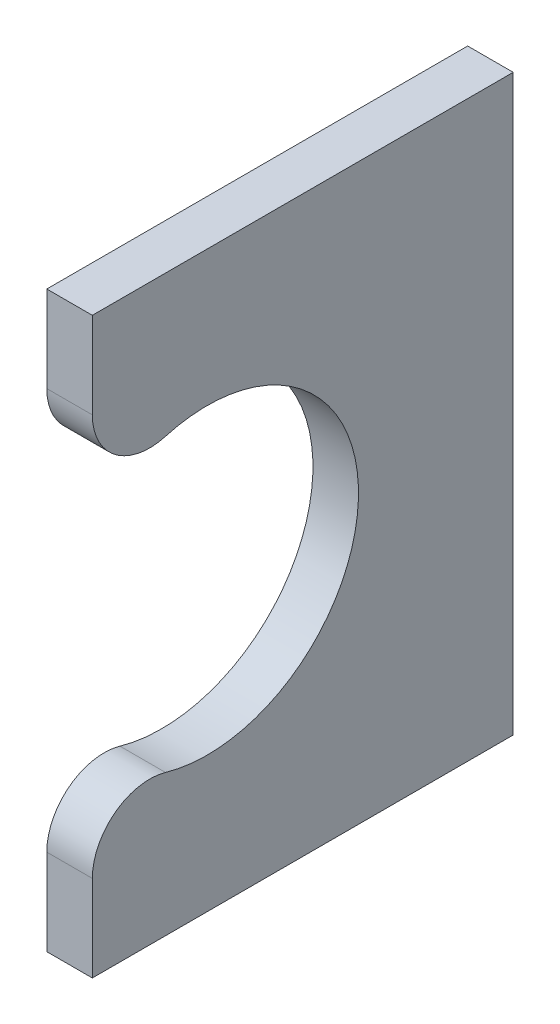
ISO-10303-21;
HEADER;
FILE_DESCRIPTION(('STEP AP214'),'2;1');
FILE_NAME('part.step','',(''),(''),'','','');
FILE_SCHEMA(('AUTOMOTIVE_DESIGN { 1 0 10303 214 1 1 1 1 }'));
ENDSEC;
DATA;
#1=APPLICATION_CONTEXT('core data for automotive mechanical design processes');
#2=APPLICATION_PROTOCOL_DEFINITION('international standard','automotive_design',2000,#1);
#3=PRODUCT_CONTEXT('',#1,'mechanical');
#4=PRODUCT('Part','Part','',(#3));
#5=PRODUCT_RELATED_PRODUCT_CATEGORY('part','',(#4));
#6=PRODUCT_DEFINITION_FORMATION('','',#4);
#7=PRODUCT_DEFINITION_CONTEXT('part definition',#1,'design');
#8=PRODUCT_DEFINITION('design','',#6,#7);
#9=PRODUCT_DEFINITION_SHAPE('','',#8);
#10=(LENGTH_UNIT() NAMED_UNIT(*) SI_UNIT(.MILLI.,.METRE.));
#11=(NAMED_UNIT(*) PLANE_ANGLE_UNIT() SI_UNIT($,.RADIAN.));
#12=(NAMED_UNIT(*) SI_UNIT($,.STERADIAN.) SOLID_ANGLE_UNIT());
#13=UNCERTAINTY_MEASURE_WITH_UNIT(LENGTH_MEASURE(1.E-05),#10,'distance_accuracy_value','');
#14=(GEOMETRIC_REPRESENTATION_CONTEXT(3) GLOBAL_UNCERTAINTY_ASSIGNED_CONTEXT((#13)) GLOBAL_UNIT_ASSIGNED_CONTEXT((#10,
#11,#12)) REPRESENTATION_CONTEXT('',''));
#15=CARTESIAN_POINT('',(0.,0.,0.));
#16=DIRECTION('',(0.,0.,1.));
#17=DIRECTION('',(1.,0.,0.));
#18=AXIS2_PLACEMENT_3D('',#15,#16,#17);
#19=CARTESIAN_POINT('',(9.525,-60.,-58.));
#20=DIRECTION('',(0.,1.,0.));
#21=DIRECTION('',(0.,0.,1.));
#22=AXIS2_PLACEMENT_3D('',#19,#20,#21);
#23=PLANE('',#22);
#24=DIRECTION('',(1.,0.,0.));
#25=VECTOR('',#24,1.);
#26=CARTESIAN_POINT('',(0.,-60.,30.));
#27=LINE('',#26,#25);
#28=CARTESIAN_POINT('',(0.,-60.,30.));
#29=VERTEX_POINT('',#28);
#30=CARTESIAN_POINT('',(9.525,-60.,30.));
#31=VERTEX_POINT('',#30);
#32=EDGE_CURVE('E182',#29,#31,#27,.T.);
#33=ORIENTED_EDGE('',*,*,#32,.F.);
#34=DIRECTION('',(0.,0.,-1.));
#35=VECTOR('',#34,1.);
#36=CARTESIAN_POINT('',(0.,-60.,-58.));
#37=LINE('',#36,#35);
#38=CARTESIAN_POINT('',(0.,-60.,-58.));
#39=VERTEX_POINT('',#38);
#40=EDGE_CURVE('E196',#29,#39,#37,.T.);
#41=ORIENTED_EDGE('',*,*,#40,.T.);
#42=DIRECTION('',(-1.,0.,0.));
#43=VECTOR('',#42,1.);
#44=CARTESIAN_POINT('',(9.525,-60.,-58.));
#45=LINE('',#44,#43);
#46=CARTESIAN_POINT('',(9.525,-60.,-58.));
#47=VERTEX_POINT('',#46);
#48=EDGE_CURVE('E213',#47,#39,#45,.T.);
#49=ORIENTED_EDGE('',*,*,#48,.F.);
#50=DIRECTION('',(0.,0.,1.));
#51=VECTOR('',#50,1.);
#52=CARTESIAN_POINT('',(9.525,-60.,0.));
#53=LINE('',#52,#51);
#54=EDGE_CURVE('E222',#31,#47,#53,.F.);
#55=ORIENTED_EDGE('',*,*,#54,.F.);
#56=EDGE_LOOP('',(#33,#41,#49,#55));
#57=FACE_BOUND('',#56,.T.);
#58=ADVANCED_FACE('F101',(#57),#23,.F.);
#59=CARTESIAN_POINT('',(9.525,0.,0.));
#60=DIRECTION('',(-1.,0.,0.));
#61=DIRECTION('',(0.,0.,1.));
#62=AXIS2_PLACEMENT_3D('',#59,#60,#61);
#63=PLANE('',#62);
#64=DIRECTION('',(0.,1.,0.));
#65=VECTOR('',#64,1.);
#66=CARTESIAN_POINT('',(9.525,0.,30.));
#67=LINE('',#66,#65);
#68=CARTESIAN_POINT('',(9.525,60.,30.));
#69=VERTEX_POINT('',#68);
#70=CARTESIAN_POINT('',(9.525,41.9681128953876,30.));
#71=VERTEX_POINT('',#70);
#72=EDGE_CURVE('E175',#69,#71,#67,.F.);
#73=ORIENTED_EDGE('',*,*,#72,.T.);
#74=CARTESIAN_POINT('',(9.525,41.9681128953876,18.));
#75=DIRECTION('',(-1.,0.,0.));
#76=DIRECTION('',(0.,0.,1.));
#77=AXIS2_PLACEMENT_3D('',#74,#75,#76);
#78=CIRCLE('',#77,12.);
#79=CARTESIAN_POINT('',(9.525006,30.430594027893,14.7010613201896));
#80=VERTEX_POINT('',#79);
#81=EDGE_CURVE('E297',#71,#80,#78,.F.);
#82=ORIENTED_EDGE('',*,*,#81,.T.);
#83=CARTESIAN_POINT('',(9.52501199999999,0.,6.00000000000001));
#84=DIRECTION('',(1.,0.,0.));
#85=DIRECTION('',(0.,-0.961468795535669,0.27491408696389));
#86=AXIS2_PLACEMENT_3D('',#83,#84,#85);
#87=CIRCLE('',#86,31.65);
#88=CARTESIAN_POINT('',(9.525006,-30.4305743971585,14.7010556929514));
#89=VERTEX_POINT('',#88);
#90=EDGE_CURVE('E292',#89,#80,#87,.T.);
#91=ORIENTED_EDGE('',*,*,#90,.F.);
#92=CARTESIAN_POINT('',(9.525,-41.9681128953876,18.));
#93=DIRECTION('',(-1.,0.,0.));
#94=DIRECTION('',(0.,0.,1.));
#95=AXIS2_PLACEMENT_3D('',#92,#93,#94);
#96=CIRCLE('',#95,12.);
#97=CARTESIAN_POINT('',(9.525,-41.9681128953876,30.));
#98=VERTEX_POINT('',#97);
#99=EDGE_CURVE('E294',#89,#98,#96,.F.);
#100=ORIENTED_EDGE('',*,*,#99,.T.);
#101=DIRECTION('',(0.,1.,0.));
#102=VECTOR('',#101,1.);
#103=CARTESIAN_POINT('',(9.525,0.,30.));
#104=LINE('',#103,#102);
#105=EDGE_CURVE('E191',#31,#98,#104,.T.);
#106=ORIENTED_EDGE('',*,*,#105,.F.);
#107=ORIENTED_EDGE('',*,*,#54,.T.);
#108=DIRECTION('',(0.,1.,0.));
#109=VECTOR('',#108,1.);
#110=CARTESIAN_POINT('',(9.525,-60.,-58.));
#111=LINE('',#110,#109);
#112=CARTESIAN_POINT('',(9.525,60.,-58.));
#113=VERTEX_POINT('',#112);
#114=EDGE_CURVE('E217',#47,#113,#111,.T.);
#115=ORIENTED_EDGE('',*,*,#114,.T.);
#116=DIRECTION('',(0.,0.,1.));
#117=VECTOR('',#116,1.);
#118=CARTESIAN_POINT('',(9.525,60.,0.));
#119=LINE('',#118,#117);
#120=EDGE_CURVE('E215',#113,#69,#119,.T.);
#121=ORIENTED_EDGE('',*,*,#120,.T.);
#122=EDGE_LOOP('',(#73,#82,#91,#100,#106,#107,#115,#121));
#123=FACE_BOUND('',#122,.T.);
#124=ADVANCED_FACE('F230',(#123),#63,.F.);
#125=CARTESIAN_POINT('',(9.525,60.,-58.));
#126=DIRECTION('',(0.,-1.,0.));
#127=DIRECTION('',(0.,0.,-1.));
#128=AXIS2_PLACEMENT_3D('',#125,#126,#127);
#129=PLANE('',#128);
#130=DIRECTION('',(0.,0.,1.));
#131=VECTOR('',#130,1.);
#132=CARTESIAN_POINT('',(0.,60.,-58.));
#133=LINE('',#132,#131);
#134=CARTESIAN_POINT('',(0.,60.,-58.));
#135=VERTEX_POINT('',#134);
#136=CARTESIAN_POINT('',(0.,60.,30.));
#137=VERTEX_POINT('',#136);
#138=EDGE_CURVE('E189',#135,#137,#133,.T.);
#139=ORIENTED_EDGE('',*,*,#138,.T.);
#140=DIRECTION('',(1.,0.,0.));
#141=VECTOR('',#140,1.);
#142=CARTESIAN_POINT('',(0.,60.,30.));
#143=LINE('',#142,#141);
#144=EDGE_CURVE('E169',#137,#69,#143,.T.);
#145=ORIENTED_EDGE('',*,*,#144,.T.);
#146=ORIENTED_EDGE('',*,*,#120,.F.);
#147=DIRECTION('',(-1.,0.,0.));
#148=VECTOR('',#147,1.);
#149=CARTESIAN_POINT('',(9.525,60.,-58.));
#150=LINE('',#149,#148);
#151=EDGE_CURVE('E198',#113,#135,#150,.T.);
#152=ORIENTED_EDGE('',*,*,#151,.T.);
#153=EDGE_LOOP('',(#139,#145,#146,#152));
#154=FACE_BOUND('',#153,.T.);
#155=ADVANCED_FACE('F192',(#154),#129,.F.);
#156=CARTESIAN_POINT('',(9.525,-60.,-58.));
#157=DIRECTION('',(0.,0.,1.));
#158=DIRECTION('',(1.,0.,0.));
#159=AXIS2_PLACEMENT_3D('',#156,#157,#158);
#160=PLANE('',#159);
#161=CARTESIAN_POINT('',(4.76250000000001,0.,-58.));
#162=DIRECTION('',(0.,0.,-1.));
#163=DIRECTION('',(-1.,0.,0.));
#164=AXIS2_PLACEMENT_3D('',#161,#162,#163);
#165=CIRCLE('',#164,1.65);
#166=CARTESIAN_POINT('',(3.11250000000001,0.,-58.));
#167=VERTEX_POINT('',#166);
#168=EDGE_CURVE('E347',#167,#167,#165,.T.);
#169=ORIENTED_EDGE('',*,*,#168,.F.);
#170=EDGE_LOOP('',(#169));
#171=FACE_BOUND('',#170,.T.);
#172=CARTESIAN_POINT('',(4.76250000000001,27.,-58.));
#173=DIRECTION('',(0.,0.,-1.));
#174=DIRECTION('',(-1.,0.,0.));
#175=AXIS2_PLACEMENT_3D('',#172,#173,#174);
#176=CIRCLE('',#175,1.65);
#177=CARTESIAN_POINT('',(3.11250000000001,27.,-58.));
#178=VERTEX_POINT('',#177);
#179=EDGE_CURVE('E353',#178,#178,#176,.T.);
#180=ORIENTED_EDGE('',*,*,#179,.F.);
#181=EDGE_LOOP('',(#180));
#182=FACE_BOUND('',#181,.T.);
#183=CARTESIAN_POINT('',(4.76250000000001,54.,-58.));
#184=DIRECTION('',(0.,0.,-1.));
#185=DIRECTION('',(-1.,0.,0.));
#186=AXIS2_PLACEMENT_3D('',#183,#184,#185);
#187=CIRCLE('',#186,1.65);
#188=CARTESIAN_POINT('',(3.11250000000001,54.,-58.));
#189=VERTEX_POINT('',#188);
#190=EDGE_CURVE('E278',#189,#189,#187,.T.);
#191=ORIENTED_EDGE('',*,*,#190,.F.);
#192=EDGE_LOOP('',(#191));
#193=FACE_BOUND('',#192,.T.);
#194=CARTESIAN_POINT('',(4.76250000000001,-54.,-58.));
#195=DIRECTION('',(0.,0.,-1.));
#196=DIRECTION('',(-1.,0.,0.));
#197=AXIS2_PLACEMENT_3D('',#194,#195,#196);
#198=CIRCLE('',#197,1.65);
#199=CARTESIAN_POINT('',(3.11250000000001,-54.,-58.));
#200=VERTEX_POINT('',#199);
#201=EDGE_CURVE('E337',#200,#200,#198,.T.);
#202=ORIENTED_EDGE('',*,*,#201,.F.);
#203=EDGE_LOOP('',(#202));
#204=FACE_BOUND('',#203,.T.);
#205=CARTESIAN_POINT('',(4.76250000000001,-27.,-58.));
#206=DIRECTION('',(0.,0.,-1.));
#207=DIRECTION('',(-1.,0.,0.));
#208=AXIS2_PLACEMENT_3D('',#205,#206,#207);
#209=CIRCLE('',#208,1.65);
#210=CARTESIAN_POINT('',(3.11250000000001,-27.,-58.));
#211=VERTEX_POINT('',#210);
#212=EDGE_CURVE('E206',#211,#211,#209,.T.);
#213=ORIENTED_EDGE('',*,*,#212,.F.);
#214=EDGE_LOOP('',(#213));
#215=FACE_BOUND('',#214,.T.);
#216=DIRECTION('',(0.,1.,0.));
#217=VECTOR('',#216,1.);
#218=CARTESIAN_POINT('',(0.,-60.,-58.));
#219=LINE('',#218,#217);
#220=EDGE_CURVE('E201',#39,#135,#219,.T.);
#221=ORIENTED_EDGE('',*,*,#220,.T.);
#222=ORIENTED_EDGE('',*,*,#151,.F.);
#223=ORIENTED_EDGE('',*,*,#114,.F.);
#224=ORIENTED_EDGE('',*,*,#48,.T.);
#225=EDGE_LOOP('',(#221,#222,#223,#224));
#226=FACE_BOUND('',#225,.T.);
#227=ADVANCED_FACE('F245',(#171,#182,#193,#204,#215,#226),#160,.F.);
#228=CARTESIAN_POINT('',(0.,0.,0.));
#229=DIRECTION('',(-1.,0.,0.));
#230=DIRECTION('',(0.,0.,1.));
#231=AXIS2_PLACEMENT_3D('',#228,#229,#230);
#232=PLANE('',#231);
#233=CARTESIAN_POINT('',(0.,0.,6.00000000000001));
#234=DIRECTION('',(1.,0.,0.));
#235=DIRECTION('',(0.,0.,-1.));
#236=AXIS2_PLACEMENT_3D('',#233,#234,#235);
#237=CIRCLE('',#236,31.65);
#238=CARTESIAN_POINT('',(0.,-30.4304873571367,14.7010309278351));
#239=VERTEX_POINT('',#238);
#240=CARTESIAN_POINT('',(0.,30.4304873571367,14.7010309278351));
#241=VERTEX_POINT('',#240);
#242=EDGE_CURVE('E330',#239,#241,#237,.T.);
#243=ORIENTED_EDGE('',*,*,#242,.T.);
#244=CARTESIAN_POINT('',(0.,41.9681128953876,18.));
#245=DIRECTION('',(-1.,0.,0.));
#246=DIRECTION('',(0.,0.,1.));
#247=AXIS2_PLACEMENT_3D('',#244,#245,#246);
#248=CIRCLE('',#247,12.);
#249=CARTESIAN_POINT('',(0.,41.9681128953876,30.));
#250=VERTEX_POINT('',#249);
#251=EDGE_CURVE('E109',#241,#250,#248,.T.);
#252=ORIENTED_EDGE('',*,*,#251,.T.);
#253=DIRECTION('',(0.,-1.,0.));
#254=VECTOR('',#253,1.);
#255=CARTESIAN_POINT('',(0.,0.,30.));
#256=LINE('',#255,#254);
#257=EDGE_CURVE('E172',#137,#250,#256,.T.);
#258=ORIENTED_EDGE('',*,*,#257,.F.);
#259=ORIENTED_EDGE('',*,*,#138,.F.);
#260=ORIENTED_EDGE('',*,*,#220,.F.);
#261=ORIENTED_EDGE('',*,*,#40,.F.);
#262=DIRECTION('',(0.,1.,0.));
#263=VECTOR('',#262,1.);
#264=CARTESIAN_POINT('',(0.,0.,30.));
#265=LINE('',#264,#263);
#266=CARTESIAN_POINT('',(0.,-41.9681128953876,30.));
#267=VERTEX_POINT('',#266);
#268=EDGE_CURVE('E185',#29,#267,#265,.T.);
#269=ORIENTED_EDGE('',*,*,#268,.T.);
#270=CARTESIAN_POINT('',(0.,-41.9681128953876,18.));
#271=DIRECTION('',(-1.,0.,0.));
#272=DIRECTION('',(0.,0.,1.));
#273=AXIS2_PLACEMENT_3D('',#270,#271,#272);
#274=CIRCLE('',#273,12.);
#275=EDGE_CURVE('E313',#267,#239,#274,.T.);
#276=ORIENTED_EDGE('',*,*,#275,.T.);
#277=EDGE_LOOP('',(#243,#252,#258,#259,#260,#261,#269,#276));
#278=FACE_BOUND('',#277,.T.);
#279=ADVANCED_FACE('F186',(#278),#232,.T.);
#280=CARTESIAN_POINT('',(4.76250000000001,-27.,-48.));
#281=DIRECTION('',(0.,0.,-1.));
#282=DIRECTION('',(-1.,0.,0.));
#283=AXIS2_PLACEMENT_3D('',#280,#281,#282);
#284=CYLINDRICAL_SURFACE('',#283,1.65);
#285=CARTESIAN_POINT('',(4.76250000000001,-27.,-48.));
#286=DIRECTION('',(0.,0.,-1.));
#287=DIRECTION('',(-1.,0.,0.));
#288=AXIS2_PLACEMENT_3D('',#285,#286,#287);
#289=CIRCLE('',#288,1.65);
#290=CARTESIAN_POINT('',(3.11250000000001,-27.,-48.));
#291=VERTEX_POINT('',#290);
#292=EDGE_CURVE('E200',#291,#291,#289,.T.);
#293=ORIENTED_EDGE('',*,*,#292,.F.);
#294=EDGE_LOOP('',(#293));
#295=FACE_BOUND('',#294,.T.);
#296=ORIENTED_EDGE('',*,*,#212,.T.);
#297=EDGE_LOOP('',(#296));
#298=FACE_BOUND('',#297,.T.);
#299=ADVANCED_FACE('F241',(#295,#298),#284,.F.);
#300=CARTESIAN_POINT('',(0.,0.,-48.));
#301=DIRECTION('',(0.,0.,-1.));
#302=DIRECTION('',(-1.,0.,0.));
#303=AXIS2_PLACEMENT_3D('',#300,#301,#302);
#304=PLANE('',#303);
#305=ORIENTED_EDGE('',*,*,#292,.T.);
#306=EDGE_LOOP('',(#305));
#307=FACE_BOUND('',#306,.T.);
#308=ADVANCED_FACE('F390',(#307),#304,.T.);
#309=CARTESIAN_POINT('',(4.76250000000001,-54.,-48.));
#310=DIRECTION('',(0.,0.,-1.));
#311=DIRECTION('',(-1.,0.,0.));
#312=AXIS2_PLACEMENT_3D('',#309,#310,#311);
#313=CYLINDRICAL_SURFACE('',#312,1.65);
#314=CARTESIAN_POINT('',(4.76250000000001,-54.,-48.));
#315=DIRECTION('',(0.,0.,-1.));
#316=DIRECTION('',(-1.,0.,0.));
#317=AXIS2_PLACEMENT_3D('',#314,#315,#316);
#318=CIRCLE('',#317,1.65);
#319=CARTESIAN_POINT('',(3.11250000000001,-54.,-48.));
#320=VERTEX_POINT('',#319);
#321=EDGE_CURVE('E334',#320,#320,#318,.T.);
#322=ORIENTED_EDGE('',*,*,#321,.F.);
#323=EDGE_LOOP('',(#322));
#324=FACE_BOUND('',#323,.T.);
#325=ORIENTED_EDGE('',*,*,#201,.T.);
#326=EDGE_LOOP('',(#325));
#327=FACE_BOUND('',#326,.T.);
#328=ADVANCED_FACE('F381',(#324,#327),#313,.F.);
#329=CARTESIAN_POINT('',(4.76250000000001,-54.,-48.));
#330=DIRECTION('',(0.,0.,-1.));
#331=DIRECTION('',(-1.,0.,0.));
#332=AXIS2_PLACEMENT_3D('',#329,#330,#331);
#333=PLANE('',#332);
#334=ORIENTED_EDGE('',*,*,#321,.T.);
#335=EDGE_LOOP('',(#334));
#336=FACE_BOUND('',#335,.T.);
#337=ADVANCED_FACE('F372',(#336),#333,.T.);
#338=CARTESIAN_POINT('',(4.76250000000001,54.,-48.));
#339=DIRECTION('',(0.,0.,-1.));
#340=DIRECTION('',(-1.,0.,0.));
#341=AXIS2_PLACEMENT_3D('',#338,#339,#340);
#342=CYLINDRICAL_SURFACE('',#341,1.65);
#343=CARTESIAN_POINT('',(4.76250000000001,54.,-48.));
#344=DIRECTION('',(0.,0.,-1.));
#345=DIRECTION('',(-1.,0.,0.));
#346=AXIS2_PLACEMENT_3D('',#343,#344,#345);
#347=CIRCLE('',#346,1.65);
#348=CARTESIAN_POINT('',(3.11250000000001,54.,-48.));
#349=VERTEX_POINT('',#348);
#350=EDGE_CURVE('E343',#349,#349,#347,.T.);
#351=ORIENTED_EDGE('',*,*,#350,.F.);
#352=EDGE_LOOP('',(#351));
#353=FACE_BOUND('',#352,.T.);
#354=ORIENTED_EDGE('',*,*,#190,.T.);
#355=EDGE_LOOP('',(#354));
#356=FACE_BOUND('',#355,.T.);
#357=ADVANCED_FACE('F272',(#353,#356),#342,.F.);
#358=CARTESIAN_POINT('',(0.,0.,-48.));
#359=DIRECTION('',(0.,0.,-1.));
#360=DIRECTION('',(-1.,0.,0.));
#361=AXIS2_PLACEMENT_3D('',#358,#359,#360);
#362=PLANE('',#361);
#363=ORIENTED_EDGE('',*,*,#350,.T.);
#364=EDGE_LOOP('',(#363));
#365=FACE_BOUND('',#364,.T.);
#366=ADVANCED_FACE('F371',(#365),#362,.T.);
#367=CARTESIAN_POINT('',(4.76250000000001,27.,-48.));
#368=DIRECTION('',(0.,0.,-1.));
#369=DIRECTION('',(-1.,0.,0.));
#370=AXIS2_PLACEMENT_3D('',#367,#368,#369);
#371=CYLINDRICAL_SURFACE('',#370,1.65);
#372=CARTESIAN_POINT('',(4.76250000000001,27.,-48.));
#373=DIRECTION('',(0.,0.,-1.));
#374=DIRECTION('',(-1.,0.,0.));
#375=AXIS2_PLACEMENT_3D('',#372,#373,#374);
#376=CIRCLE('',#375,1.65);
#377=CARTESIAN_POINT('',(3.11250000000001,27.,-48.));
#378=VERTEX_POINT('',#377);
#379=EDGE_CURVE('E358',#378,#378,#376,.T.);
#380=ORIENTED_EDGE('',*,*,#379,.F.);
#381=EDGE_LOOP('',(#380));
#382=FACE_BOUND('',#381,.T.);
#383=ORIENTED_EDGE('',*,*,#179,.T.);
#384=EDGE_LOOP('',(#383));
#385=FACE_BOUND('',#384,.T.);
#386=ADVANCED_FACE('F379',(#382,#385),#371,.F.);
#387=CARTESIAN_POINT('',(0.,0.,-48.));
#388=DIRECTION('',(0.,0.,-1.));
#389=DIRECTION('',(-1.,0.,0.));
#390=AXIS2_PLACEMENT_3D('',#387,#388,#389);
#391=PLANE('',#390);
#392=ORIENTED_EDGE('',*,*,#379,.T.);
#393=EDGE_LOOP('',(#392));
#394=FACE_BOUND('',#393,.T.);
#395=ADVANCED_FACE('F393',(#394),#391,.T.);
#396=CARTESIAN_POINT('',(4.76250000000001,0.,-48.));
#397=DIRECTION('',(0.,0.,-1.));
#398=DIRECTION('',(-1.,0.,0.));
#399=AXIS2_PLACEMENT_3D('',#396,#397,#398);
#400=CYLINDRICAL_SURFACE('',#399,1.65);
#401=CARTESIAN_POINT('',(4.76250000000001,0.,-48.));
#402=DIRECTION('',(0.,0.,-1.));
#403=DIRECTION('',(-1.,0.,0.));
#404=AXIS2_PLACEMENT_3D('',#401,#402,#403);
#405=CIRCLE('',#404,1.65);
#406=CARTESIAN_POINT('',(3.11250000000001,0.,-48.));
#407=VERTEX_POINT('',#406);
#408=EDGE_CURVE('E348',#407,#407,#405,.T.);
#409=ORIENTED_EDGE('',*,*,#408,.F.);
#410=EDGE_LOOP('',(#409));
#411=FACE_BOUND('',#410,.T.);
#412=ORIENTED_EDGE('',*,*,#168,.T.);
#413=EDGE_LOOP('',(#412));
#414=FACE_BOUND('',#413,.T.);
#415=ADVANCED_FACE('F391',(#411,#414),#400,.F.);
#416=CARTESIAN_POINT('',(0.,0.,-48.));
#417=DIRECTION('',(0.,0.,-1.));
#418=DIRECTION('',(-1.,0.,0.));
#419=AXIS2_PLACEMENT_3D('',#416,#417,#418);
#420=PLANE('',#419);
#421=ORIENTED_EDGE('',*,*,#408,.T.);
#422=EDGE_LOOP('',(#421));
#423=FACE_BOUND('',#422,.T.);
#424=ADVANCED_FACE('F262',(#423),#420,.T.);
#425=CARTESIAN_POINT('',(0.,0.,30.));
#426=DIRECTION('',(0.,0.,-1.));
#427=DIRECTION('',(-1.,0.,0.));
#428=AXIS2_PLACEMENT_3D('',#425,#426,#427);
#429=PLANE('',#428);
#430=ORIENTED_EDGE('',*,*,#105,.T.);
#431=DIRECTION('',(1.,0.,0.));
#432=VECTOR('',#431,1.);
#433=CARTESIAN_POINT('',(0.,-41.9681128953876,30.));
#434=LINE('',#433,#432);
#435=EDGE_CURVE('E12',#98,#267,#434,.F.);
#436=ORIENTED_EDGE('',*,*,#435,.T.);
#437=ORIENTED_EDGE('',*,*,#268,.F.);
#438=ORIENTED_EDGE('',*,*,#32,.T.);
#439=EDGE_LOOP('',(#430,#436,#437,#438));
#440=FACE_BOUND('',#439,.T.);
#441=ADVANCED_FACE('F263',(#440),#429,.F.);
#442=CARTESIAN_POINT('',(0.,0.,30.));
#443=DIRECTION('',(0.,0.,1.));
#444=DIRECTION('',(0.,-1.,0.));
#445=AXIS2_PLACEMENT_3D('',#442,#443,#444);
#446=PLANE('',#445);
#447=ORIENTED_EDGE('',*,*,#257,.T.);
#448=DIRECTION('',(-1.,0.,0.));
#449=VECTOR('',#448,1.);
#450=CARTESIAN_POINT('',(9.52499999999999,41.9681128953876,30.));
#451=LINE('',#450,#449);
#452=EDGE_CURVE('E220',#250,#71,#451,.F.);
#453=ORIENTED_EDGE('',*,*,#452,.T.);
#454=ORIENTED_EDGE('',*,*,#72,.F.);
#455=ORIENTED_EDGE('',*,*,#144,.F.);
#456=EDGE_LOOP('',(#447,#453,#454,#455));
#457=FACE_BOUND('',#456,.T.);
#458=ADVANCED_FACE('F168',(#457),#446,.T.);
#459=CARTESIAN_POINT('',(0.,0.,6.00000000000001));
#460=DIRECTION('',(1.,0.,0.));
#461=DIRECTION('',(0.,0.,-1.));
#462=AXIS2_PLACEMENT_3D('',#459,#460,#461);
#463=CYLINDRICAL_SURFACE('',#462,31.65);
#464=ORIENTED_EDGE('',*,*,#90,.T.);
#465=DIRECTION('',(1.,0.,0.));
#466=VECTOR('',#465,1.);
#467=CARTESIAN_POINT('',(0.,30.4304873571367,14.7010309278351));
#468=LINE('',#467,#466);
#469=EDGE_CURVE('E123',#80,#241,#468,.F.);
#470=ORIENTED_EDGE('',*,*,#469,.T.);
#471=ORIENTED_EDGE('',*,*,#242,.F.);
#472=DIRECTION('',(1.,0.,0.));
#473=VECTOR('',#472,1.);
#474=CARTESIAN_POINT('',(0.,-30.4304873571367,14.7010309278351));
#475=LINE('',#474,#473);
#476=EDGE_CURVE('E305',#239,#89,#475,.T.);
#477=ORIENTED_EDGE('',*,*,#476,.T.);
#478=EDGE_LOOP('',(#464,#470,#471,#477));
#479=FACE_BOUND('',#478,.T.);
#480=ADVANCED_FACE('F254',(#479),#463,.F.);
#481=CARTESIAN_POINT('',(0.,41.9681128953876,18.));
#482=DIRECTION('',(1.,0.,0.));
#483=DIRECTION('',(0.,0.,-1.));
#484=AXIS2_PLACEMENT_3D('',#481,#482,#483);
#485=CYLINDRICAL_SURFACE('',#484,12.);
#486=ORIENTED_EDGE('',*,*,#251,.F.);
#487=ORIENTED_EDGE('',*,*,#469,.F.);
#488=ORIENTED_EDGE('',*,*,#81,.F.);
#489=ORIENTED_EDGE('',*,*,#452,.F.);
#490=EDGE_LOOP('',(#486,#487,#488,#489));
#491=FACE_BOUND('',#490,.T.);
#492=ADVANCED_FACE('F251',(#491),#485,.T.);
#493=CARTESIAN_POINT('',(0.,-41.9681128953876,18.));
#494=DIRECTION('',(1.,0.,0.));
#495=DIRECTION('',(0.,0.,-1.));
#496=AXIS2_PLACEMENT_3D('',#493,#494,#495);
#497=CYLINDRICAL_SURFACE('',#496,12.);
#498=ORIENTED_EDGE('',*,*,#275,.F.);
#499=ORIENTED_EDGE('',*,*,#435,.F.);
#500=ORIENTED_EDGE('',*,*,#99,.F.);
#501=ORIENTED_EDGE('',*,*,#476,.F.);
#502=EDGE_LOOP('',(#498,#499,#500,#501));
#503=FACE_BOUND('',#502,.T.);
#504=ADVANCED_FACE('F103',(#503),#497,.T.);
#505=CLOSED_SHELL('',(#58,#124,#155,#227,#279,#299,#308,#328,#337,#357,#366,#386,#395,#415,#424,
#441,#458,#480,#492,#504));
#506=MANIFOLD_SOLID_BREP('B2',#505);
#507=ADVANCED_BREP_SHAPE_REPRESENTATION('',(#18,#506),#14);
#508=SHAPE_DEFINITION_REPRESENTATION(#9,#507);
ENDSEC;
END-ISO-10303-21;
